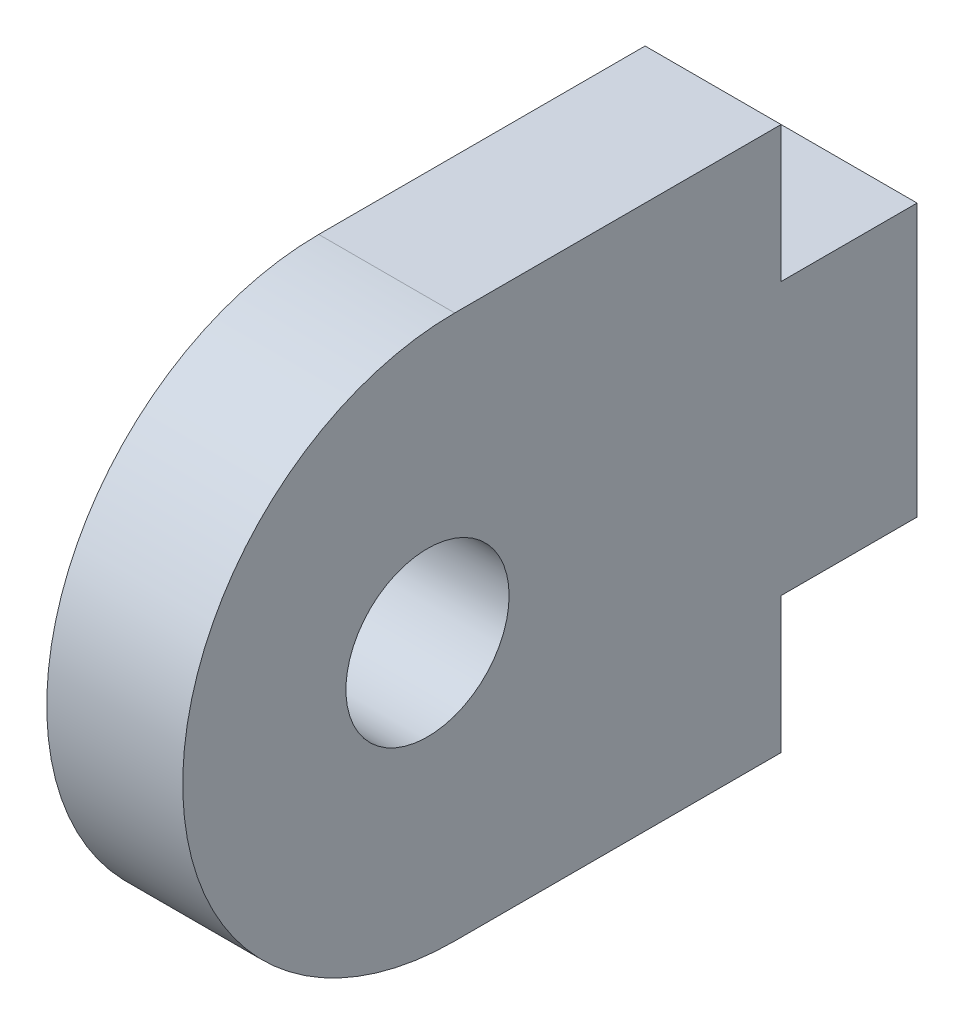
ISO-10303-21;
HEADER;
FILE_DESCRIPTION(('STEP AP214'),'2;1');
FILE_NAME('part.step','',(''),(''),'','','');
FILE_SCHEMA(('AUTOMOTIVE_DESIGN { 1 0 10303 214 1 1 1 1 }'));
ENDSEC;
DATA;
#1=APPLICATION_CONTEXT('core data for automotive mechanical design processes');
#2=APPLICATION_PROTOCOL_DEFINITION('international standard','automotive_design',2000,#1);
#3=PRODUCT_CONTEXT('',#1,'mechanical');
#4=PRODUCT('Part','Part','',(#3));
#5=PRODUCT_RELATED_PRODUCT_CATEGORY('part','',(#4));
#6=PRODUCT_DEFINITION_FORMATION('','',#4);
#7=PRODUCT_DEFINITION_CONTEXT('part definition',#1,'design');
#8=PRODUCT_DEFINITION('design','',#6,#7);
#9=PRODUCT_DEFINITION_SHAPE('','',#8);
#10=(LENGTH_UNIT() NAMED_UNIT(*) SI_UNIT(.MILLI.,.METRE.));
#11=(NAMED_UNIT(*) PLANE_ANGLE_UNIT() SI_UNIT($,.RADIAN.));
#12=(NAMED_UNIT(*) SI_UNIT($,.STERADIAN.) SOLID_ANGLE_UNIT());
#13=UNCERTAINTY_MEASURE_WITH_UNIT(LENGTH_MEASURE(1.E-05),#10,'distance_accuracy_value','');
#14=(GEOMETRIC_REPRESENTATION_CONTEXT(3) GLOBAL_UNCERTAINTY_ASSIGNED_CONTEXT((#13)) GLOBAL_UNIT_ASSIGNED_CONTEXT((#10,
#11,#12)) REPRESENTATION_CONTEXT('',''));
#15=CARTESIAN_POINT('',(0.,0.,0.));
#16=DIRECTION('',(0.,0.,1.));
#17=DIRECTION('',(1.,0.,0.));
#18=AXIS2_PLACEMENT_3D('',#15,#16,#17);
#19=CARTESIAN_POINT('',(2.5,0.,17.));
#20=DIRECTION('',(-1.,0.,0.));
#21=DIRECTION('',(0.,0.,1.));
#22=AXIS2_PLACEMENT_3D('',#19,#20,#21);
#23=CYLINDRICAL_SURFACE('',#22,10.);
#24=DIRECTION('',(-1.,0.,0.));
#25=VECTOR('',#24,1.);
#26=CARTESIAN_POINT('',(2.5,-10.,17.));
#27=LINE('',#26,#25);
#28=CARTESIAN_POINT('',(2.5,-10.,17.));
#29=VERTEX_POINT('',#28);
#30=CARTESIAN_POINT('',(-2.5,-10.,17.));
#31=VERTEX_POINT('',#30);
#32=EDGE_CURVE('E121',#29,#31,#27,.T.);
#33=ORIENTED_EDGE('',*,*,#32,.F.);
#34=CARTESIAN_POINT('',(2.5,0.,17.));
#35=DIRECTION('',(-1.,0.,0.));
#36=DIRECTION('',(0.,0.,1.));
#37=AXIS2_PLACEMENT_3D('',#34,#35,#36);
#38=CIRCLE('',#37,10.);
#39=CARTESIAN_POINT('',(2.5,10.,17.));
#40=VERTEX_POINT('',#39);
#41=EDGE_CURVE('E49',#40,#29,#38,.F.);
#42=ORIENTED_EDGE('',*,*,#41,.F.);
#43=DIRECTION('',(-1.,0.,0.));
#44=VECTOR('',#43,1.);
#45=CARTESIAN_POINT('',(2.5,10.,17.));
#46=LINE('',#45,#44);
#47=CARTESIAN_POINT('',(-2.5,10.,17.));
#48=VERTEX_POINT('',#47);
#49=EDGE_CURVE('E168',#48,#40,#46,.F.);
#50=ORIENTED_EDGE('',*,*,#49,.F.);
#51=CARTESIAN_POINT('',(-2.5,0.,17.));
#52=DIRECTION('',(-1.,0.,0.));
#53=DIRECTION('',(0.,0.,1.));
#54=AXIS2_PLACEMENT_3D('',#51,#52,#53);
#55=CIRCLE('',#54,10.);
#56=EDGE_CURVE('E11',#31,#48,#55,.T.);
#57=ORIENTED_EDGE('',*,*,#56,.F.);
#58=EDGE_LOOP('',(#33,#42,#50,#57));
#59=FACE_BOUND('',#58,.T.);
#60=ADVANCED_FACE('F41',(#59),#23,.T.);
#61=CARTESIAN_POINT('',(2.5,0.,0.));
#62=DIRECTION('',(-1.,0.,0.));
#63=DIRECTION('',(0.,0.,1.));
#64=AXIS2_PLACEMENT_3D('',#61,#62,#63);
#65=PLANE('',#64);
#66=DIRECTION('',(0.,0.,1.));
#67=VECTOR('',#66,1.);
#68=CARTESIAN_POINT('',(2.5,10.,5.));
#69=LINE('',#68,#67);
#70=CARTESIAN_POINT('',(2.5,10.,5.));
#71=VERTEX_POINT('',#70);
#72=EDGE_CURVE('E138',#71,#40,#69,.T.);
#73=ORIENTED_EDGE('',*,*,#72,.T.);
#74=ORIENTED_EDGE('',*,*,#41,.T.);
#75=DIRECTION('',(0.,0.,-1.));
#76=VECTOR('',#75,1.);
#77=CARTESIAN_POINT('',(2.5,-10.,5.));
#78=LINE('',#77,#76);
#79=CARTESIAN_POINT('',(2.5,-10.,5.));
#80=VERTEX_POINT('',#79);
#81=EDGE_CURVE('E103',#29,#80,#78,.T.);
#82=ORIENTED_EDGE('',*,*,#81,.T.);
#83=DIRECTION('',(0.,1.,0.));
#84=VECTOR('',#83,1.);
#85=CARTESIAN_POINT('',(2.5,-5.,5.));
#86=LINE('',#85,#84);
#87=CARTESIAN_POINT('',(2.5,-5.,5.));
#88=VERTEX_POINT('',#87);
#89=EDGE_CURVE('E109',#80,#88,#86,.T.);
#90=ORIENTED_EDGE('',*,*,#89,.T.);
#91=DIRECTION('',(0.,0.,-1.));
#92=VECTOR('',#91,1.);
#93=CARTESIAN_POINT('',(2.5,-5.,0.));
#94=LINE('',#93,#92);
#95=CARTESIAN_POINT('',(2.5,-5.,0.));
#96=VERTEX_POINT('',#95);
#97=EDGE_CURVE('E127',#88,#96,#94,.T.);
#98=ORIENTED_EDGE('',*,*,#97,.T.);
#99=DIRECTION('',(0.,1.,0.));
#100=VECTOR('',#99,1.);
#101=CARTESIAN_POINT('',(2.5,-5.,0.));
#102=LINE('',#101,#100);
#103=CARTESIAN_POINT('',(2.5,5.,0.));
#104=VERTEX_POINT('',#103);
#105=EDGE_CURVE('E129',#96,#104,#102,.T.);
#106=ORIENTED_EDGE('',*,*,#105,.T.);
#107=DIRECTION('',(0.,0.,1.));
#108=VECTOR('',#107,1.);
#109=CARTESIAN_POINT('',(2.5,5.,0.));
#110=LINE('',#109,#108);
#111=CARTESIAN_POINT('',(2.5,5.,5.));
#112=VERTEX_POINT('',#111);
#113=EDGE_CURVE('E134',#104,#112,#110,.T.);
#114=ORIENTED_EDGE('',*,*,#113,.T.);
#115=DIRECTION('',(0.,1.,0.));
#116=VECTOR('',#115,1.);
#117=CARTESIAN_POINT('',(2.5,5.,5.));
#118=LINE('',#117,#116);
#119=EDGE_CURVE('E136',#112,#71,#118,.T.);
#120=ORIENTED_EDGE('',*,*,#119,.T.);
#121=EDGE_LOOP('',(#73,#74,#82,#90,#98,#106,#114,#120));
#122=FACE_BOUND('',#121,.T.);
#123=CARTESIAN_POINT('',(2.5,0.,18.));
#124=DIRECTION('',(1.,0.,0.));
#125=DIRECTION('',(0.,0.,-1.));
#126=AXIS2_PLACEMENT_3D('',#123,#124,#125);
#127=CIRCLE('',#126,3.);
#128=CARTESIAN_POINT('',(2.5,0.,15.));
#129=VERTEX_POINT('',#128);
#130=EDGE_CURVE('E143',#129,#129,#127,.T.);
#131=ORIENTED_EDGE('',*,*,#130,.F.);
#132=EDGE_LOOP('',(#131));
#133=FACE_BOUND('',#132,.T.);
#134=ADVANCED_FACE('F106',(#122,#133),#65,.F.);
#135=CARTESIAN_POINT('',(-2.5,0.,0.));
#136=DIRECTION('',(-1.,0.,0.));
#137=DIRECTION('',(0.,0.,1.));
#138=AXIS2_PLACEMENT_3D('',#135,#136,#137);
#139=PLANE('',#138);
#140=DIRECTION('',(0.,0.,-1.));
#141=VECTOR('',#140,1.);
#142=CARTESIAN_POINT('',(-2.5,-10.,5.));
#143=LINE('',#142,#141);
#144=CARTESIAN_POINT('',(-2.5,-10.,5.));
#145=VERTEX_POINT('',#144);
#146=EDGE_CURVE('E118',#31,#145,#143,.T.);
#147=ORIENTED_EDGE('',*,*,#146,.F.);
#148=ORIENTED_EDGE('',*,*,#56,.T.);
#149=DIRECTION('',(0.,0.,1.));
#150=VECTOR('',#149,1.);
#151=CARTESIAN_POINT('',(-2.5,10.,5.));
#152=LINE('',#151,#150);
#153=CARTESIAN_POINT('',(-2.5,10.,5.));
#154=VERTEX_POINT('',#153);
#155=EDGE_CURVE('E113',#154,#48,#152,.T.);
#156=ORIENTED_EDGE('',*,*,#155,.F.);
#157=DIRECTION('',(0.,1.,0.));
#158=VECTOR('',#157,1.);
#159=CARTESIAN_POINT('',(-2.5,5.,5.));
#160=LINE('',#159,#158);
#161=CARTESIAN_POINT('',(-2.5,5.,5.));
#162=VERTEX_POINT('',#161);
#163=EDGE_CURVE('E151',#162,#154,#160,.T.);
#164=ORIENTED_EDGE('',*,*,#163,.F.);
#165=DIRECTION('',(0.,0.,1.));
#166=VECTOR('',#165,1.);
#167=CARTESIAN_POINT('',(-2.5,5.,0.));
#168=LINE('',#167,#166);
#169=CARTESIAN_POINT('',(-2.5,5.,0.));
#170=VERTEX_POINT('',#169);
#171=EDGE_CURVE('E149',#170,#162,#168,.T.);
#172=ORIENTED_EDGE('',*,*,#171,.F.);
#173=DIRECTION('',(0.,1.,0.));
#174=VECTOR('',#173,1.);
#175=CARTESIAN_POINT('',(-2.5,-5.,0.));
#176=LINE('',#175,#174);
#177=CARTESIAN_POINT('',(-2.5,-5.,0.));
#178=VERTEX_POINT('',#177);
#179=EDGE_CURVE('E147',#178,#170,#176,.T.);
#180=ORIENTED_EDGE('',*,*,#179,.F.);
#181=DIRECTION('',(0.,0.,-1.));
#182=VECTOR('',#181,1.);
#183=CARTESIAN_POINT('',(-2.5,-5.,0.));
#184=LINE('',#183,#182);
#185=CARTESIAN_POINT('',(-2.5,-5.,5.));
#186=VERTEX_POINT('',#185);
#187=EDGE_CURVE('E145',#186,#178,#184,.T.);
#188=ORIENTED_EDGE('',*,*,#187,.F.);
#189=DIRECTION('',(0.,1.,0.));
#190=VECTOR('',#189,1.);
#191=CARTESIAN_POINT('',(-2.5,-5.,5.));
#192=LINE('',#191,#190);
#193=EDGE_CURVE('E142',#145,#186,#192,.T.);
#194=ORIENTED_EDGE('',*,*,#193,.F.);
#195=EDGE_LOOP('',(#147,#148,#156,#164,#172,#180,#188,#194));
#196=FACE_BOUND('',#195,.T.);
#197=CARTESIAN_POINT('',(-2.5,0.,18.));
#198=DIRECTION('',(1.,0.,0.));
#199=DIRECTION('',(0.,0.,-1.));
#200=AXIS2_PLACEMENT_3D('',#197,#198,#199);
#201=CIRCLE('',#200,3.);
#202=CARTESIAN_POINT('',(-2.5,0.,15.));
#203=VERTEX_POINT('',#202);
#204=EDGE_CURVE('E284',#203,#203,#201,.T.);
#205=ORIENTED_EDGE('',*,*,#204,.T.);
#206=EDGE_LOOP('',(#205));
#207=FACE_BOUND('',#206,.T.);
#208=ADVANCED_FACE('F179',(#196,#207),#139,.T.);
#209=CARTESIAN_POINT('',(2.5,-10.,5.));
#210=DIRECTION('',(0.,1.,0.));
#211=DIRECTION('',(0.,0.,1.));
#212=AXIS2_PLACEMENT_3D('',#209,#210,#211);
#213=PLANE('',#212);
#214=ORIENTED_EDGE('',*,*,#81,.F.);
#215=ORIENTED_EDGE('',*,*,#32,.T.);
#216=ORIENTED_EDGE('',*,*,#146,.T.);
#217=DIRECTION('',(-1.,0.,0.));
#218=VECTOR('',#217,1.);
#219=CARTESIAN_POINT('',(2.5,-10.,5.));
#220=LINE('',#219,#218);
#221=EDGE_CURVE('E116',#80,#145,#220,.T.);
#222=ORIENTED_EDGE('',*,*,#221,.F.);
#223=EDGE_LOOP('',(#214,#215,#216,#222));
#224=FACE_BOUND('',#223,.T.);
#225=ADVANCED_FACE('F117',(#224),#213,.F.);
#226=CARTESIAN_POINT('',(2.5,-5.,5.));
#227=DIRECTION('',(0.,0.,1.));
#228=DIRECTION('',(1.,0.,0.));
#229=AXIS2_PLACEMENT_3D('',#226,#227,#228);
#230=PLANE('',#229);
#231=ORIENTED_EDGE('',*,*,#193,.T.);
#232=DIRECTION('',(-1.,0.,0.));
#233=VECTOR('',#232,1.);
#234=CARTESIAN_POINT('',(2.5,-5.,5.));
#235=LINE('',#234,#233);
#236=EDGE_CURVE('E122',#88,#186,#235,.T.);
#237=ORIENTED_EDGE('',*,*,#236,.F.);
#238=ORIENTED_EDGE('',*,*,#89,.F.);
#239=ORIENTED_EDGE('',*,*,#221,.T.);
#240=EDGE_LOOP('',(#231,#237,#238,#239));
#241=FACE_BOUND('',#240,.T.);
#242=ADVANCED_FACE('F124',(#241),#230,.F.);
#243=CARTESIAN_POINT('',(2.5,-5.,0.));
#244=DIRECTION('',(0.,1.,0.));
#245=DIRECTION('',(0.,0.,1.));
#246=AXIS2_PLACEMENT_3D('',#243,#244,#245);
#247=PLANE('',#246);
#248=ORIENTED_EDGE('',*,*,#187,.T.);
#249=DIRECTION('',(-1.,0.,0.));
#250=VECTOR('',#249,1.);
#251=CARTESIAN_POINT('',(2.5,-5.,0.));
#252=LINE('',#251,#250);
#253=EDGE_CURVE('E163',#96,#178,#252,.T.);
#254=ORIENTED_EDGE('',*,*,#253,.F.);
#255=ORIENTED_EDGE('',*,*,#97,.F.);
#256=ORIENTED_EDGE('',*,*,#236,.T.);
#257=EDGE_LOOP('',(#248,#254,#255,#256));
#258=FACE_BOUND('',#257,.T.);
#259=ADVANCED_FACE('F192',(#258),#247,.F.);
#260=CARTESIAN_POINT('',(2.5,-5.,0.));
#261=DIRECTION('',(0.,0.,1.));
#262=DIRECTION('',(1.,0.,0.));
#263=AXIS2_PLACEMENT_3D('',#260,#261,#262);
#264=PLANE('',#263);
#265=ORIENTED_EDGE('',*,*,#179,.T.);
#266=DIRECTION('',(-1.,0.,0.));
#267=VECTOR('',#266,1.);
#268=CARTESIAN_POINT('',(2.5,5.,0.));
#269=LINE('',#268,#267);
#270=EDGE_CURVE('E160',#104,#170,#269,.T.);
#271=ORIENTED_EDGE('',*,*,#270,.F.);
#272=ORIENTED_EDGE('',*,*,#105,.F.);
#273=ORIENTED_EDGE('',*,*,#253,.T.);
#274=EDGE_LOOP('',(#265,#271,#272,#273));
#275=FACE_BOUND('',#274,.T.);
#276=ADVANCED_FACE('F189',(#275),#264,.F.);
#277=CARTESIAN_POINT('',(2.5,5.,0.));
#278=DIRECTION('',(0.,-1.,0.));
#279=DIRECTION('',(0.,0.,-1.));
#280=AXIS2_PLACEMENT_3D('',#277,#278,#279);
#281=PLANE('',#280);
#282=ORIENTED_EDGE('',*,*,#171,.T.);
#283=DIRECTION('',(-1.,0.,0.));
#284=VECTOR('',#283,1.);
#285=CARTESIAN_POINT('',(2.5,5.,5.));
#286=LINE('',#285,#284);
#287=EDGE_CURVE('E157',#112,#162,#286,.T.);
#288=ORIENTED_EDGE('',*,*,#287,.F.);
#289=ORIENTED_EDGE('',*,*,#113,.F.);
#290=ORIENTED_EDGE('',*,*,#270,.T.);
#291=EDGE_LOOP('',(#282,#288,#289,#290));
#292=FACE_BOUND('',#291,.T.);
#293=ADVANCED_FACE('F185',(#292),#281,.F.);
#294=CARTESIAN_POINT('',(2.5,5.,5.));
#295=DIRECTION('',(0.,0.,1.));
#296=DIRECTION('',(0.,-1.,0.));
#297=AXIS2_PLACEMENT_3D('',#294,#295,#296);
#298=PLANE('',#297);
#299=ORIENTED_EDGE('',*,*,#163,.T.);
#300=DIRECTION('',(-1.,0.,0.));
#301=VECTOR('',#300,1.);
#302=CARTESIAN_POINT('',(2.5,10.,5.));
#303=LINE('',#302,#301);
#304=EDGE_CURVE('E140',#71,#154,#303,.T.);
#305=ORIENTED_EDGE('',*,*,#304,.F.);
#306=ORIENTED_EDGE('',*,*,#119,.F.);
#307=ORIENTED_EDGE('',*,*,#287,.T.);
#308=EDGE_LOOP('',(#299,#305,#306,#307));
#309=FACE_BOUND('',#308,.T.);
#310=ADVANCED_FACE('F177',(#309),#298,.F.);
#311=CARTESIAN_POINT('',(2.5,10.,5.));
#312=DIRECTION('',(0.,-1.,0.));
#313=DIRECTION('',(0.,0.,-1.));
#314=AXIS2_PLACEMENT_3D('',#311,#312,#313);
#315=PLANE('',#314);
#316=ORIENTED_EDGE('',*,*,#155,.T.);
#317=ORIENTED_EDGE('',*,*,#49,.T.);
#318=ORIENTED_EDGE('',*,*,#72,.F.);
#319=ORIENTED_EDGE('',*,*,#304,.T.);
#320=EDGE_LOOP('',(#316,#317,#318,#319));
#321=FACE_BOUND('',#320,.T.);
#322=ADVANCED_FACE('F171',(#321),#315,.F.);
#323=CARTESIAN_POINT('',(2.5,0.,18.));
#324=DIRECTION('',(-1.,0.,0.));
#325=DIRECTION('',(0.,0.,1.));
#326=AXIS2_PLACEMENT_3D('',#323,#324,#325);
#327=CYLINDRICAL_SURFACE('',#326,3.);
#328=ORIENTED_EDGE('',*,*,#130,.T.);
#329=EDGE_LOOP('',(#328));
#330=FACE_BOUND('',#329,.T.);
#331=ORIENTED_EDGE('',*,*,#204,.F.);
#332=EDGE_LOOP('',(#331));
#333=FACE_BOUND('',#332,.T.);
#334=ADVANCED_FACE('F212',(#330,#333),#327,.F.);
#335=CLOSED_SHELL('',(#60,#134,#208,#225,#242,#259,#276,#293,#310,#322,#334));
#336=MANIFOLD_SOLID_BREP('B2',#335);
#337=ADVANCED_BREP_SHAPE_REPRESENTATION('',(#18,#336),#14);
#338=SHAPE_DEFINITION_REPRESENTATION(#9,#337);
ENDSEC;
END-ISO-10303-21;
